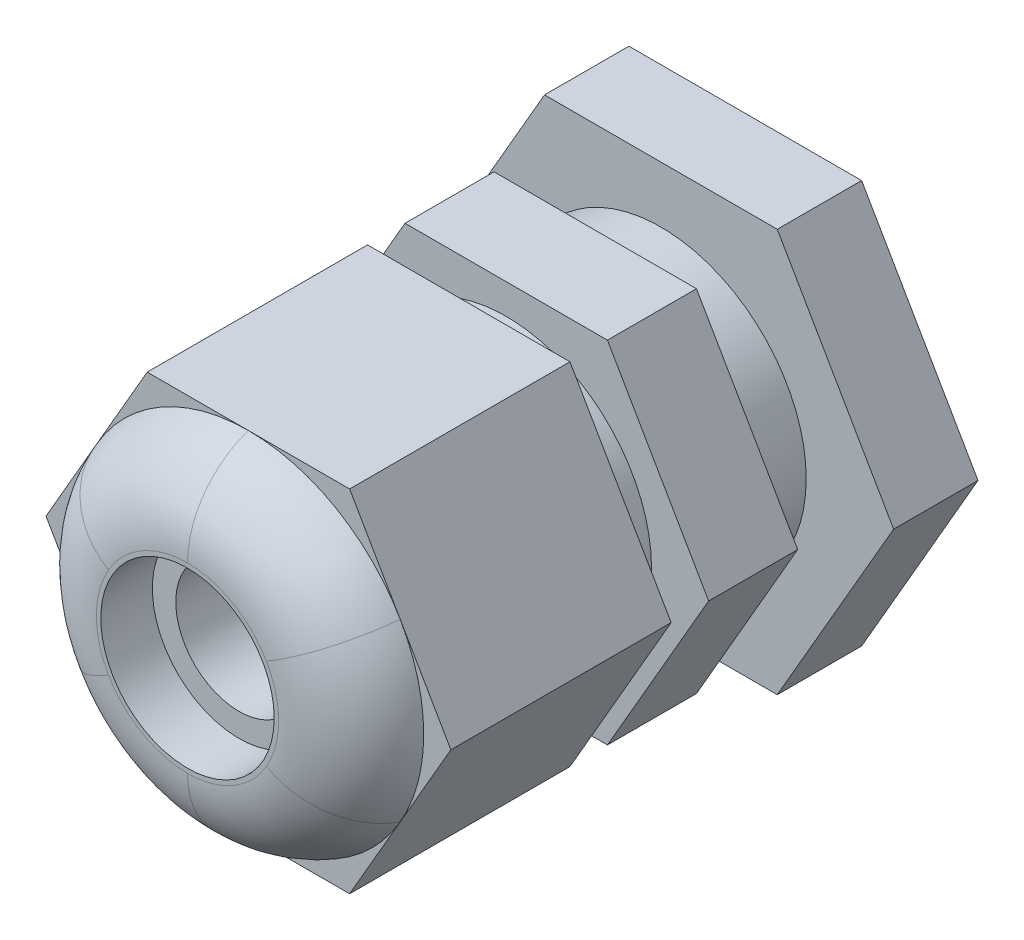
ISO-10303-21;
HEADER;
FILE_DESCRIPTION(('STEP AP214'),'2;1');
FILE_NAME('part.step','',(''),(''),'','','');
FILE_SCHEMA(('AUTOMOTIVE_DESIGN { 1 0 10303 214 1 1 1 1 }'));
ENDSEC;
DATA;
#1=APPLICATION_CONTEXT('core data for automotive mechanical design processes');
#2=APPLICATION_PROTOCOL_DEFINITION('international standard','automotive_design',2000,#1);
#3=PRODUCT_CONTEXT('',#1,'mechanical');
#4=PRODUCT('Part','Part','',(#3));
#5=PRODUCT_RELATED_PRODUCT_CATEGORY('part','',(#4));
#6=PRODUCT_DEFINITION_FORMATION('','',#4);
#7=PRODUCT_DEFINITION_CONTEXT('part definition',#1,'design');
#8=PRODUCT_DEFINITION('design','',#6,#7);
#9=PRODUCT_DEFINITION_SHAPE('','',#8);
#10=(LENGTH_UNIT() NAMED_UNIT(*) SI_UNIT(.MILLI.,.METRE.));
#11=(NAMED_UNIT(*) PLANE_ANGLE_UNIT() SI_UNIT($,.RADIAN.));
#12=(NAMED_UNIT(*) SI_UNIT($,.STERADIAN.) SOLID_ANGLE_UNIT());
#13=UNCERTAINTY_MEASURE_WITH_UNIT(LENGTH_MEASURE(1.E-05),#10,'distance_accuracy_value','');
#14=(GEOMETRIC_REPRESENTATION_CONTEXT(3) GLOBAL_UNCERTAINTY_ASSIGNED_CONTEXT((#13)) GLOBAL_UNIT_ASSIGNED_CONTEXT((#10,
#11,#12)) REPRESENTATION_CONTEXT('',''));
#15=CARTESIAN_POINT('',(0.,0.,0.));
#16=DIRECTION('',(0.,0.,1.));
#17=DIRECTION('',(1.,0.,0.));
#18=AXIS2_PLACEMENT_3D('',#15,#16,#17);
#19=CARTESIAN_POINT('',(0.,0.,11.75));
#20=DIRECTION('',(0.,0.,1.));
#21=DIRECTION('',(1.,0.,0.));
#22=AXIS2_PLACEMENT_3D('',#19,#20,#21);
#23=PLANE('',#22);
#24=CARTESIAN_POINT('',(0.,0.,11.75));
#25=DIRECTION('',(0.,0.,1.));
#26=DIRECTION('',(1.,0.,0.));
#27=AXIS2_PLACEMENT_3D('',#24,#25,#26);
#28=CIRCLE('',#27,9.35);
#29=CARTESIAN_POINT('',(8.0973375253845,4.675,11.75));
#30=VERTEX_POINT('',#29);
#31=CARTESIAN_POINT('',(0.,9.35,11.75));
#32=VERTEX_POINT('',#31);
#33=EDGE_CURVE('E222',#30,#32,#28,.T.);
#34=ORIENTED_EDGE('',*,*,#33,.F.);
#35=DIRECTION('',(-0.5,0.866025403784439,0.));
#36=VECTOR('',#35,1.);
#37=CARTESIAN_POINT('',(10.796450033846,0.,11.75));
#38=LINE('',#37,#36);
#39=CARTESIAN_POINT('',(5.39822501692301,9.35,11.75));
#40=VERTEX_POINT('',#39);
#41=EDGE_CURVE('E210',#30,#40,#38,.T.);
#42=ORIENTED_EDGE('',*,*,#41,.T.);
#43=DIRECTION('',(-1.,0.,0.));
#44=VECTOR('',#43,1.);
#45=CARTESIAN_POINT('',(5.39822501692301,9.35,11.75));
#46=LINE('',#45,#44);
#47=EDGE_CURVE('E223',#40,#32,#46,.T.);
#48=ORIENTED_EDGE('',*,*,#47,.T.);
#49=EDGE_LOOP('',(#34,#42,#48));
#50=FACE_BOUND('',#49,.T.);
#51=ADVANCED_FACE('F37',(#50),#23,.T.);
#52=CARTESIAN_POINT('',(-8.0973375253845,4.675,11.75));
#53=VERTEX_POINT('',#52);
#54=EDGE_CURVE('E231',#32,#53,#28,.T.);
#55=ORIENTED_EDGE('',*,*,#54,.F.);
#56=CARTESIAN_POINT('',(-5.398225016923,9.35,11.75));
#57=VERTEX_POINT('',#56);
#58=EDGE_CURVE('E209',#32,#57,#46,.T.);
#59=ORIENTED_EDGE('',*,*,#58,.T.);
#60=DIRECTION('',(-0.5,-0.866025403784439,0.));
#61=VECTOR('',#60,1.);
#62=CARTESIAN_POINT('',(-5.398225016923,9.35,11.75));
#63=LINE('',#62,#61);
#64=EDGE_CURVE('E304',#57,#53,#63,.T.);
#65=ORIENTED_EDGE('',*,*,#64,.T.);
#66=EDGE_LOOP('',(#55,#59,#65));
#67=FACE_BOUND('',#66,.T.);
#68=ADVANCED_FACE('F496',(#67),#23,.T.);
#69=CARTESIAN_POINT('',(-8.09733752538451,-4.675,11.75));
#70=VERTEX_POINT('',#69);
#71=EDGE_CURVE('E542',#53,#70,#28,.T.);
#72=ORIENTED_EDGE('',*,*,#71,.F.);
#73=CARTESIAN_POINT('',(-10.796450033846,0.,11.75));
#74=VERTEX_POINT('',#73);
#75=EDGE_CURVE('E307',#53,#74,#63,.T.);
#76=ORIENTED_EDGE('',*,*,#75,.T.);
#77=DIRECTION('',(0.5,-0.866025403784439,0.));
#78=VECTOR('',#77,1.);
#79=CARTESIAN_POINT('',(-10.796450033846,0.,11.75));
#80=LINE('',#79,#78);
#81=EDGE_CURVE('E300',#74,#70,#80,.T.);
#82=ORIENTED_EDGE('',*,*,#81,.T.);
#83=EDGE_LOOP('',(#72,#76,#82));
#84=FACE_BOUND('',#83,.T.);
#85=ADVANCED_FACE('F501',(#84),#23,.T.);
#86=CARTESIAN_POINT('',(0.,-9.35,11.75));
#87=VERTEX_POINT('',#86);
#88=EDGE_CURVE('E534',#70,#87,#28,.T.);
#89=ORIENTED_EDGE('',*,*,#88,.F.);
#90=CARTESIAN_POINT('',(-5.39822501692301,-9.35,11.75));
#91=VERTEX_POINT('',#90);
#92=EDGE_CURVE('E303',#70,#91,#80,.T.);
#93=ORIENTED_EDGE('',*,*,#92,.T.);
#94=DIRECTION('',(1.,0.,0.));
#95=VECTOR('',#94,1.);
#96=CARTESIAN_POINT('',(-5.39822501692301,-9.35,11.75));
#97=LINE('',#96,#95);
#98=EDGE_CURVE('E282',#91,#87,#97,.T.);
#99=ORIENTED_EDGE('',*,*,#98,.T.);
#100=EDGE_LOOP('',(#89,#93,#99));
#101=FACE_BOUND('',#100,.T.);
#102=ADVANCED_FACE('F520',(#101),#23,.T.);
#103=CARTESIAN_POINT('',(8.09733752538451,-4.675,11.75));
#104=VERTEX_POINT('',#103);
#105=EDGE_CURVE('E241',#87,#104,#28,.T.);
#106=ORIENTED_EDGE('',*,*,#105,.F.);
#107=CARTESIAN_POINT('',(5.398225016923,-9.35,11.75));
#108=VERTEX_POINT('',#107);
#109=EDGE_CURVE('E299',#87,#108,#97,.T.);
#110=ORIENTED_EDGE('',*,*,#109,.T.);
#111=DIRECTION('',(0.5,0.866025403784439,0.));
#112=VECTOR('',#111,1.);
#113=CARTESIAN_POINT('',(5.398225016923,-9.35,11.75));
#114=LINE('',#113,#112);
#115=EDGE_CURVE('E220',#108,#104,#114,.T.);
#116=ORIENTED_EDGE('',*,*,#115,.T.);
#117=EDGE_LOOP('',(#106,#110,#116));
#118=FACE_BOUND('',#117,.T.);
#119=ADVANCED_FACE('F508',(#118),#23,.T.);
#120=CARTESIAN_POINT('',(5.398225016923,-9.35,11.75));
#121=DIRECTION('',(-0.866025403784438,0.5,0.));
#122=DIRECTION('',(-0.5,-0.866025403784439,0.));
#123=AXIS2_PLACEMENT_3D('',#120,#121,#122);
#124=PLANE('',#123);
#125=DIRECTION('',(0.5,0.866025403784439,0.));
#126=VECTOR('',#125,1.);
#127=CARTESIAN_POINT('',(5.398225016923,-9.35,0.));
#128=LINE('',#127,#126);
#129=CARTESIAN_POINT('',(5.398225016923,-9.35,0.));
#130=VERTEX_POINT('',#129);
#131=CARTESIAN_POINT('',(10.796450033846,0.,0.));
#132=VERTEX_POINT('',#131);
#133=EDGE_CURVE('E293',#130,#132,#128,.T.);
#134=ORIENTED_EDGE('',*,*,#133,.T.);
#135=DIRECTION('',(0.,0.,-1.));
#136=VECTOR('',#135,1.);
#137=CARTESIAN_POINT('',(10.796450033846,0.,11.75));
#138=LINE('',#137,#136);
#139=CARTESIAN_POINT('',(10.796450033846,0.,11.75));
#140=VERTEX_POINT('',#139);
#141=EDGE_CURVE('E266',#140,#132,#138,.T.);
#142=ORIENTED_EDGE('',*,*,#141,.F.);
#143=EDGE_CURVE('E205',#104,#140,#114,.T.);
#144=ORIENTED_EDGE('',*,*,#143,.F.);
#145=ORIENTED_EDGE('',*,*,#115,.F.);
#146=DIRECTION('',(0.,0.,-1.));
#147=VECTOR('',#146,1.);
#148=CARTESIAN_POINT('',(5.398225016923,-9.35,11.75));
#149=LINE('',#148,#147);
#150=EDGE_CURVE('E279',#108,#130,#149,.T.);
#151=ORIENTED_EDGE('',*,*,#150,.T.);
#152=EDGE_LOOP('',(#134,#142,#144,#145,#151));
#153=FACE_BOUND('',#152,.T.);
#154=ADVANCED_FACE('F519',(#153),#124,.F.);
#155=CARTESIAN_POINT('',(10.796450033846,0.,11.75));
#156=DIRECTION('',(-0.866025403784439,-0.5,0.));
#157=DIRECTION('',(0.5,-0.866025403784439,0.));
#158=AXIS2_PLACEMENT_3D('',#155,#156,#157);
#159=PLANE('',#158);
#160=DIRECTION('',(-0.5,0.866025403784439,0.));
#161=VECTOR('',#160,1.);
#162=CARTESIAN_POINT('',(10.796450033846,0.,0.));
#163=LINE('',#162,#161);
#164=CARTESIAN_POINT('',(5.39822501692301,9.35,0.));
#165=VERTEX_POINT('',#164);
#166=EDGE_CURVE('E291',#132,#165,#163,.T.);
#167=ORIENTED_EDGE('',*,*,#166,.T.);
#168=DIRECTION('',(0.,0.,-1.));
#169=VECTOR('',#168,1.);
#170=CARTESIAN_POINT('',(5.39822501692301,9.35,11.75));
#171=LINE('',#170,#169);
#172=EDGE_CURVE('E216',#40,#165,#171,.T.);
#173=ORIENTED_EDGE('',*,*,#172,.F.);
#174=ORIENTED_EDGE('',*,*,#41,.F.);
#175=EDGE_CURVE('E199',#140,#30,#38,.T.);
#176=ORIENTED_EDGE('',*,*,#175,.F.);
#177=ORIENTED_EDGE('',*,*,#141,.T.);
#178=EDGE_LOOP('',(#167,#173,#174,#176,#177));
#179=FACE_BOUND('',#178,.T.);
#180=ADVANCED_FACE('F214',(#179),#159,.F.);
#181=CARTESIAN_POINT('',(5.39822501692301,9.35,11.75));
#182=DIRECTION('',(0.,-1.,0.));
#183=DIRECTION('',(1.,0.,0.));
#184=AXIS2_PLACEMENT_3D('',#181,#182,#183);
#185=PLANE('',#184);
#186=DIRECTION('',(-1.,0.,0.));
#187=VECTOR('',#186,1.);
#188=CARTESIAN_POINT('',(5.39822501692301,9.35,0.));
#189=LINE('',#188,#187);
#190=CARTESIAN_POINT('',(-5.398225016923,9.35,0.));
#191=VERTEX_POINT('',#190);
#192=EDGE_CURVE('E289',#165,#191,#189,.T.);
#193=ORIENTED_EDGE('',*,*,#192,.T.);
#194=DIRECTION('',(0.,0.,-1.));
#195=VECTOR('',#194,1.);
#196=CARTESIAN_POINT('',(-5.398225016923,9.35,11.75));
#197=LINE('',#196,#195);
#198=EDGE_CURVE('E270',#57,#191,#197,.T.);
#199=ORIENTED_EDGE('',*,*,#198,.F.);
#200=ORIENTED_EDGE('',*,*,#58,.F.);
#201=ORIENTED_EDGE('',*,*,#47,.F.);
#202=ORIENTED_EDGE('',*,*,#172,.T.);
#203=EDGE_LOOP('',(#193,#199,#200,#201,#202));
#204=FACE_BOUND('',#203,.T.);
#205=ADVANCED_FACE('F559',(#204),#185,.F.);
#206=CARTESIAN_POINT('',(-5.398225016923,9.35,11.75));
#207=DIRECTION('',(0.866025403784439,-0.5,0.));
#208=DIRECTION('',(0.5,0.866025403784439,0.));
#209=AXIS2_PLACEMENT_3D('',#206,#207,#208);
#210=PLANE('',#209);
#211=DIRECTION('',(-0.5,-0.866025403784439,0.));
#212=VECTOR('',#211,1.);
#213=CARTESIAN_POINT('',(-5.398225016923,9.35,0.));
#214=LINE('',#213,#212);
#215=CARTESIAN_POINT('',(-10.796450033846,0.,0.));
#216=VERTEX_POINT('',#215);
#217=EDGE_CURVE('E287',#191,#216,#214,.T.);
#218=ORIENTED_EDGE('',*,*,#217,.T.);
#219=DIRECTION('',(0.,0.,-1.));
#220=VECTOR('',#219,1.);
#221=CARTESIAN_POINT('',(-10.796450033846,0.,11.75));
#222=LINE('',#221,#220);
#223=EDGE_CURVE('E273',#74,#216,#222,.T.);
#224=ORIENTED_EDGE('',*,*,#223,.F.);
#225=ORIENTED_EDGE('',*,*,#75,.F.);
#226=ORIENTED_EDGE('',*,*,#64,.F.);
#227=ORIENTED_EDGE('',*,*,#198,.T.);
#228=EDGE_LOOP('',(#218,#224,#225,#226,#227));
#229=FACE_BOUND('',#228,.T.);
#230=ADVANCED_FACE('F556',(#229),#210,.F.);
#231=CARTESIAN_POINT('',(-10.796450033846,0.,11.75));
#232=DIRECTION('',(0.866025403784439,0.5,0.));
#233=DIRECTION('',(-0.5,0.866025403784439,0.));
#234=AXIS2_PLACEMENT_3D('',#231,#232,#233);
#235=PLANE('',#234);
#236=DIRECTION('',(0.5,-0.866025403784439,0.));
#237=VECTOR('',#236,1.);
#238=CARTESIAN_POINT('',(-10.796450033846,0.,0.));
#239=LINE('',#238,#237);
#240=CARTESIAN_POINT('',(-5.39822501692301,-9.35,0.));
#241=VERTEX_POINT('',#240);
#242=EDGE_CURVE('E285',#216,#241,#239,.T.);
#243=ORIENTED_EDGE('',*,*,#242,.T.);
#244=DIRECTION('',(0.,0.,-1.));
#245=VECTOR('',#244,1.);
#246=CARTESIAN_POINT('',(-5.39822501692301,-9.35,11.75));
#247=LINE('',#246,#245);
#248=EDGE_CURVE('E276',#91,#241,#247,.T.);
#249=ORIENTED_EDGE('',*,*,#248,.F.);
#250=ORIENTED_EDGE('',*,*,#92,.F.);
#251=ORIENTED_EDGE('',*,*,#81,.F.);
#252=ORIENTED_EDGE('',*,*,#223,.T.);
#253=EDGE_LOOP('',(#243,#249,#250,#251,#252));
#254=FACE_BOUND('',#253,.T.);
#255=ADVANCED_FACE('F515',(#254),#235,.F.);
#256=CARTESIAN_POINT('',(-5.39822501692301,-9.35,11.75));
#257=DIRECTION('',(0.,1.,0.));
#258=DIRECTION('',(0.,0.,1.));
#259=AXIS2_PLACEMENT_3D('',#256,#257,#258);
#260=PLANE('',#259);
#261=DIRECTION('',(1.,0.,0.));
#262=VECTOR('',#261,1.);
#263=CARTESIAN_POINT('',(-5.39822501692301,-9.35,0.));
#264=LINE('',#263,#262);
#265=EDGE_CURVE('E283',#241,#130,#264,.T.);
#266=ORIENTED_EDGE('',*,*,#265,.T.);
#267=ORIENTED_EDGE('',*,*,#150,.F.);
#268=ORIENTED_EDGE('',*,*,#109,.F.);
#269=ORIENTED_EDGE('',*,*,#98,.F.);
#270=ORIENTED_EDGE('',*,*,#248,.T.);
#271=EDGE_LOOP('',(#266,#267,#268,#269,#270));
#272=FACE_BOUND('',#271,.T.);
#273=ADVANCED_FACE('F507',(#272),#260,.F.);
#274=EDGE_CURVE('E203',#104,#30,#28,.T.);
#275=ORIENTED_EDGE('',*,*,#274,.F.);
#276=ORIENTED_EDGE('',*,*,#143,.T.);
#277=ORIENTED_EDGE('',*,*,#175,.T.);
#278=EDGE_LOOP('',(#275,#276,#277));
#279=FACE_BOUND('',#278,.T.);
#280=ADVANCED_FACE('F201',(#279),#23,.T.);
#281=CARTESIAN_POINT('',(0.,0.,0.));
#282=DIRECTION('',(0.,0.,1.));
#283=DIRECTION('',(1.,0.,0.));
#284=AXIS2_PLACEMENT_3D('',#281,#282,#283);
#285=PLANE('',#284);
#286=CARTESIAN_POINT('',(0.,0.,0.));
#287=DIRECTION('',(0.,0.,-1.));
#288=DIRECTION('',(-1.,0.,0.));
#289=AXIS2_PLACEMENT_3D('',#286,#287,#288);
#290=CIRCLE('',#289,7.75);
#291=CARTESIAN_POINT('',(-7.75,0.,0.));
#292=VERTEX_POINT('',#291);
#293=EDGE_CURVE('E268',#292,#292,#290,.T.);
#294=ORIENTED_EDGE('',*,*,#293,.F.);
#295=EDGE_LOOP('',(#294));
#296=FACE_BOUND('',#295,.T.);
#297=ORIENTED_EDGE('',*,*,#133,.F.);
#298=ORIENTED_EDGE('',*,*,#265,.F.);
#299=ORIENTED_EDGE('',*,*,#242,.F.);
#300=ORIENTED_EDGE('',*,*,#217,.F.);
#301=ORIENTED_EDGE('',*,*,#192,.F.);
#302=ORIENTED_EDGE('',*,*,#166,.F.);
#303=EDGE_LOOP('',(#297,#298,#299,#300,#301,#302));
#304=FACE_BOUND('',#303,.T.);
#305=ADVANCED_FACE('F506',(#296,#304),#285,.F.);
#306=CARTESIAN_POINT('',(0.,0.,-2.));
#307=DIRECTION('',(0.,0.,1.));
#308=DIRECTION('',(1.,0.,0.));
#309=AXIS2_PLACEMENT_3D('',#306,#307,#308);
#310=CYLINDRICAL_SURFACE('',#309,7.75);
#311=CARTESIAN_POINT('',(0.,0.,-2.));
#312=DIRECTION('',(0.,0.,-1.));
#313=DIRECTION('',(-1.,0.,0.));
#314=AXIS2_PLACEMENT_3D('',#311,#312,#313);
#315=CIRCLE('',#314,7.75);
#316=CARTESIAN_POINT('',(-7.75,0.,-2.));
#317=VERTEX_POINT('',#316);
#318=EDGE_CURVE('E296',#317,#317,#315,.T.);
#319=ORIENTED_EDGE('',*,*,#318,.F.);
#320=EDGE_LOOP('',(#319));
#321=FACE_BOUND('',#320,.T.);
#322=ORIENTED_EDGE('',*,*,#293,.T.);
#323=EDGE_LOOP('',(#322));
#324=FACE_BOUND('',#323,.T.);
#325=ADVANCED_FACE('F513',(#321,#324),#310,.T.);
#326=CARTESIAN_POINT('',(-5.39822501692299,-9.35000000000001,-6.75));
#327=DIRECTION('',(0.866025403784438,0.5,0.));
#328=DIRECTION('',(-0.5,0.866025403784438,0.));
#329=AXIS2_PLACEMENT_3D('',#326,#327,#328);
#330=PLANE('',#329);
#331=DIRECTION('',(-0.5,0.866025403784438,0.));
#332=VECTOR('',#331,1.);
#333=CARTESIAN_POINT('',(-5.39822501692299,-9.35000000000001,-2.));
#334=LINE('',#333,#332);
#335=CARTESIAN_POINT('',(-5.39822501692299,-9.35000000000001,-2.));
#336=VERTEX_POINT('',#335);
#337=CARTESIAN_POINT('',(-10.796450033846,0.,-2.));
#338=VERTEX_POINT('',#337);
#339=EDGE_CURVE('E346',#336,#338,#334,.T.);
#340=ORIENTED_EDGE('',*,*,#339,.T.);
#341=DIRECTION('',(0.,0.,1.));
#342=VECTOR('',#341,1.);
#343=CARTESIAN_POINT('',(-10.796450033846,0.,-6.75));
#344=LINE('',#343,#342);
#345=CARTESIAN_POINT('',(-10.796450033846,0.,-6.75));
#346=VERTEX_POINT('',#345);
#347=EDGE_CURVE('E316',#346,#338,#344,.T.);
#348=ORIENTED_EDGE('',*,*,#347,.F.);
#349=DIRECTION('',(-0.5,0.866025403784438,0.));
#350=VECTOR('',#349,1.);
#351=CARTESIAN_POINT('',(-5.39822501692299,-9.35000000000001,-6.75));
#352=LINE('',#351,#350);
#353=CARTESIAN_POINT('',(-5.39822501692299,-9.35000000000001,-6.75));
#354=VERTEX_POINT('',#353);
#355=EDGE_CURVE('E337',#354,#346,#352,.T.);
#356=ORIENTED_EDGE('',*,*,#355,.F.);
#357=DIRECTION('',(0.,0.,1.));
#358=VECTOR('',#357,1.);
#359=CARTESIAN_POINT('',(-5.39822501692299,-9.35000000000001,-6.75));
#360=LINE('',#359,#358);
#361=EDGE_CURVE('E331',#354,#336,#360,.T.);
#362=ORIENTED_EDGE('',*,*,#361,.T.);
#363=EDGE_LOOP('',(#340,#348,#356,#362));
#364=FACE_BOUND('',#363,.T.);
#365=ADVANCED_FACE('F703',(#364),#330,.F.);
#366=CARTESIAN_POINT('',(-10.796450033846,0.,-6.75));
#367=DIRECTION('',(0.866025403784439,-0.499999999999999,0.));
#368=DIRECTION('',(0.499999999999999,0.866025403784439,0.));
#369=AXIS2_PLACEMENT_3D('',#366,#367,#368);
#370=PLANE('',#369);
#371=DIRECTION('',(0.499999999999999,0.866025403784439,0.));
#372=VECTOR('',#371,1.);
#373=CARTESIAN_POINT('',(-10.796450033846,0.,-2.));
#374=LINE('',#373,#372);
#375=CARTESIAN_POINT('',(-5.39822501692301,9.35000000000001,-2.));
#376=VERTEX_POINT('',#375);
#377=EDGE_CURVE('E344',#338,#376,#374,.T.);
#378=ORIENTED_EDGE('',*,*,#377,.T.);
#379=DIRECTION('',(0.,0.,1.));
#380=VECTOR('',#379,1.);
#381=CARTESIAN_POINT('',(-5.39822501692301,9.35000000000001,-6.75));
#382=LINE('',#381,#380);
#383=CARTESIAN_POINT('',(-5.39822501692301,9.35000000000001,-6.75));
#384=VERTEX_POINT('',#383);
#385=EDGE_CURVE('E319',#384,#376,#382,.T.);
#386=ORIENTED_EDGE('',*,*,#385,.F.);
#387=DIRECTION('',(0.499999999999999,0.866025403784439,0.));
#388=VECTOR('',#387,1.);
#389=CARTESIAN_POINT('',(-10.796450033846,0.,-6.75));
#390=LINE('',#389,#388);
#391=EDGE_CURVE('E357',#346,#384,#390,.T.);
#392=ORIENTED_EDGE('',*,*,#391,.F.);
#393=ORIENTED_EDGE('',*,*,#347,.T.);
#394=EDGE_LOOP('',(#378,#386,#392,#393));
#395=FACE_BOUND('',#394,.T.);
#396=ADVANCED_FACE('F711',(#395),#370,.F.);
#397=CARTESIAN_POINT('',(-5.39822501692301,9.35000000000001,-6.75));
#398=DIRECTION('',(0.,-1.,0.));
#399=DIRECTION('',(1.,0.,0.));
#400=AXIS2_PLACEMENT_3D('',#397,#398,#399);
#401=PLANE('',#400);
#402=DIRECTION('',(1.,0.,0.));
#403=VECTOR('',#402,1.);
#404=CARTESIAN_POINT('',(-5.39822501692301,9.35000000000001,-2.));
#405=LINE('',#404,#403);
#406=CARTESIAN_POINT('',(5.398225016923,9.35000000000002,-2.));
#407=VERTEX_POINT('',#406);
#408=EDGE_CURVE('E342',#376,#407,#405,.T.);
#409=ORIENTED_EDGE('',*,*,#408,.T.);
#410=DIRECTION('',(0.,0.,1.));
#411=VECTOR('',#410,1.);
#412=CARTESIAN_POINT('',(5.398225016923,9.35000000000002,-6.75));
#413=LINE('',#412,#411);
#414=CARTESIAN_POINT('',(5.398225016923,9.35000000000002,-6.75));
#415=VERTEX_POINT('',#414);
#416=EDGE_CURVE('E322',#415,#407,#413,.T.);
#417=ORIENTED_EDGE('',*,*,#416,.F.);
#418=DIRECTION('',(1.,0.,0.));
#419=VECTOR('',#418,1.);
#420=CARTESIAN_POINT('',(-5.39822501692301,9.35000000000001,-6.75));
#421=LINE('',#420,#419);
#422=EDGE_CURVE('E355',#384,#415,#421,.T.);
#423=ORIENTED_EDGE('',*,*,#422,.F.);
#424=ORIENTED_EDGE('',*,*,#385,.T.);
#425=EDGE_LOOP('',(#409,#417,#423,#424));
#426=FACE_BOUND('',#425,.T.);
#427=ADVANCED_FACE('F720',(#426),#401,.F.);
#428=CARTESIAN_POINT('',(5.398225016923,9.35000000000002,-6.75));
#429=DIRECTION('',(-0.866025403784438,-0.500000000000001,0.));
#430=DIRECTION('',(0.500000000000001,-0.866025403784438,0.));
#431=AXIS2_PLACEMENT_3D('',#428,#429,#430);
#432=PLANE('',#431);
#433=DIRECTION('',(0.500000000000001,-0.866025403784438,0.));
#434=VECTOR('',#433,1.);
#435=CARTESIAN_POINT('',(5.398225016923,9.35000000000002,-2.));
#436=LINE('',#435,#434);
#437=CARTESIAN_POINT('',(10.796450033846,0.,-2.));
#438=VERTEX_POINT('',#437);
#439=EDGE_CURVE('E340',#407,#438,#436,.T.);
#440=ORIENTED_EDGE('',*,*,#439,.T.);
#441=DIRECTION('',(0.,0.,1.));
#442=VECTOR('',#441,1.);
#443=CARTESIAN_POINT('',(10.796450033846,0.,-6.75));
#444=LINE('',#443,#442);
#445=CARTESIAN_POINT('',(10.796450033846,0.,-6.75));
#446=VERTEX_POINT('',#445);
#447=EDGE_CURVE('E325',#446,#438,#444,.T.);
#448=ORIENTED_EDGE('',*,*,#447,.F.);
#449=DIRECTION('',(0.500000000000001,-0.866025403784438,0.));
#450=VECTOR('',#449,1.);
#451=CARTESIAN_POINT('',(5.398225016923,9.35000000000002,-6.75));
#452=LINE('',#451,#450);
#453=EDGE_CURVE('E353',#415,#446,#452,.T.);
#454=ORIENTED_EDGE('',*,*,#453,.F.);
#455=ORIENTED_EDGE('',*,*,#416,.T.);
#456=EDGE_LOOP('',(#440,#448,#454,#455));
#457=FACE_BOUND('',#456,.T.);
#458=ADVANCED_FACE('F729',(#457),#432,.F.);
#459=CARTESIAN_POINT('',(10.796450033846,0.,-6.75));
#460=DIRECTION('',(-0.866025403784439,0.499999999999999,0.));
#461=DIRECTION('',(-0.499999999999999,-0.866025403784439,0.));
#462=AXIS2_PLACEMENT_3D('',#459,#460,#461);
#463=PLANE('',#462);
#464=DIRECTION('',(-0.499999999999999,-0.866025403784439,0.));
#465=VECTOR('',#464,1.);
#466=CARTESIAN_POINT('',(10.796450033846,0.,-2.));
#467=LINE('',#466,#465);
#468=CARTESIAN_POINT('',(5.39822501692302,-9.35,-2.));
#469=VERTEX_POINT('',#468);
#470=EDGE_CURVE('E338',#438,#469,#467,.T.);
#471=ORIENTED_EDGE('',*,*,#470,.T.);
#472=DIRECTION('',(0.,0.,1.));
#473=VECTOR('',#472,1.);
#474=CARTESIAN_POINT('',(5.39822501692302,-9.35,-6.75));
#475=LINE('',#474,#473);
#476=CARTESIAN_POINT('',(5.39822501692302,-9.35,-6.75));
#477=VERTEX_POINT('',#476);
#478=EDGE_CURVE('E328',#477,#469,#475,.T.);
#479=ORIENTED_EDGE('',*,*,#478,.F.);
#480=DIRECTION('',(-0.499999999999999,-0.866025403784439,0.));
#481=VECTOR('',#480,1.);
#482=CARTESIAN_POINT('',(10.796450033846,0.,-6.75));
#483=LINE('',#482,#481);
#484=EDGE_CURVE('E351',#446,#477,#483,.T.);
#485=ORIENTED_EDGE('',*,*,#484,.F.);
#486=ORIENTED_EDGE('',*,*,#447,.T.);
#487=EDGE_LOOP('',(#471,#479,#485,#486));
#488=FACE_BOUND('',#487,.T.);
#489=ADVANCED_FACE('F738',(#488),#463,.F.);
#490=CARTESIAN_POINT('',(5.39822501692302,-9.35,-6.75));
#491=DIRECTION('',(0.,1.,0.));
#492=DIRECTION('',(-1.,0.,0.));
#493=AXIS2_PLACEMENT_3D('',#490,#491,#492);
#494=PLANE('',#493);
#495=DIRECTION('',(-1.,0.,0.));
#496=VECTOR('',#495,1.);
#497=CARTESIAN_POINT('',(5.39822501692302,-9.35,-2.));
#498=LINE('',#497,#496);
#499=EDGE_CURVE('E335',#469,#336,#498,.T.);
#500=ORIENTED_EDGE('',*,*,#499,.T.);
#501=ORIENTED_EDGE('',*,*,#361,.F.);
#502=DIRECTION('',(-1.,0.,0.));
#503=VECTOR('',#502,1.);
#504=CARTESIAN_POINT('',(5.39822501692302,-9.35,-6.75));
#505=LINE('',#504,#503);
#506=EDGE_CURVE('E334',#477,#354,#505,.T.);
#507=ORIENTED_EDGE('',*,*,#506,.F.);
#508=ORIENTED_EDGE('',*,*,#478,.T.);
#509=EDGE_LOOP('',(#500,#501,#507,#508));
#510=FACE_BOUND('',#509,.T.);
#511=ADVANCED_FACE('F747',(#510),#494,.F.);
#512=CARTESIAN_POINT('',(0.,0.,-6.75));
#513=DIRECTION('',(0.,0.,-1.));
#514=DIRECTION('',(-1.,0.,0.));
#515=AXIS2_PLACEMENT_3D('',#512,#513,#514);
#516=PLANE('',#515);
#517=CARTESIAN_POINT('',(0.,0.,-6.75));
#518=DIRECTION('',(0.,0.,-1.));
#519=DIRECTION('',(-1.,0.,0.));
#520=AXIS2_PLACEMENT_3D('',#517,#518,#519);
#521=CIRCLE('',#520,7.75);
#522=CARTESIAN_POINT('',(-7.75,0.,-6.75));
#523=VERTEX_POINT('',#522);
#524=EDGE_CURVE('E313',#523,#523,#521,.T.);
#525=ORIENTED_EDGE('',*,*,#524,.F.);
#526=EDGE_LOOP('',(#525));
#527=FACE_BOUND('',#526,.T.);
#528=ORIENTED_EDGE('',*,*,#355,.T.);
#529=ORIENTED_EDGE('',*,*,#391,.T.);
#530=ORIENTED_EDGE('',*,*,#422,.T.);
#531=ORIENTED_EDGE('',*,*,#453,.T.);
#532=ORIENTED_EDGE('',*,*,#484,.T.);
#533=ORIENTED_EDGE('',*,*,#506,.T.);
#534=EDGE_LOOP('',(#528,#529,#530,#531,#532,#533));
#535=FACE_BOUND('',#534,.T.);
#536=ADVANCED_FACE('F756',(#527,#535),#516,.T.);
#537=CARTESIAN_POINT('',(0.,0.,-2.));
#538=DIRECTION('',(0.,0.,-1.));
#539=DIRECTION('',(-1.,0.,0.));
#540=AXIS2_PLACEMENT_3D('',#537,#538,#539);
#541=PLANE('',#540);
#542=ORIENTED_EDGE('',*,*,#318,.T.);
#543=EDGE_LOOP('',(#542));
#544=FACE_BOUND('',#543,.T.);
#545=ORIENTED_EDGE('',*,*,#339,.F.);
#546=ORIENTED_EDGE('',*,*,#499,.F.);
#547=ORIENTED_EDGE('',*,*,#470,.F.);
#548=ORIENTED_EDGE('',*,*,#439,.F.);
#549=ORIENTED_EDGE('',*,*,#408,.F.);
#550=ORIENTED_EDGE('',*,*,#377,.F.);
#551=EDGE_LOOP('',(#545,#546,#547,#548,#549,#550));
#552=FACE_BOUND('',#551,.T.);
#553=ADVANCED_FACE('F766',(#544,#552),#541,.F.);
#554=CARTESIAN_POINT('',(0.,0.,-10.25));
#555=DIRECTION('',(0.,0.,1.));
#556=DIRECTION('',(1.,0.,0.));
#557=AXIS2_PLACEMENT_3D('',#554,#555,#556);
#558=CYLINDRICAL_SURFACE('',#557,7.75);
#559=CARTESIAN_POINT('',(0.,0.,-10.25));
#560=DIRECTION('',(0.,0.,-1.));
#561=DIRECTION('',(-1.,0.,0.));
#562=AXIS2_PLACEMENT_3D('',#559,#560,#561);
#563=CIRCLE('',#562,7.75);
#564=CARTESIAN_POINT('',(-7.75,0.,-10.25));
#565=VERTEX_POINT('',#564);
#566=EDGE_CURVE('E349',#565,#565,#563,.T.);
#567=ORIENTED_EDGE('',*,*,#566,.F.);
#568=EDGE_LOOP('',(#567));
#569=FACE_BOUND('',#568,.T.);
#570=ORIENTED_EDGE('',*,*,#524,.T.);
#571=EDGE_LOOP('',(#570));
#572=FACE_BOUND('',#571,.T.);
#573=ADVANCED_FACE('F775',(#569,#572),#558,.T.);
#574=CARTESIAN_POINT('',(-6.20651539378848,-10.75,-14.75));
#575=DIRECTION('',(0.866025403784439,0.5,0.));
#576=DIRECTION('',(-0.5,0.866025403784439,0.));
#577=AXIS2_PLACEMENT_3D('',#574,#575,#576);
#578=PLANE('',#577);
#579=DIRECTION('',(-0.5,0.866025403784439,0.));
#580=VECTOR('',#579,1.);
#581=CARTESIAN_POINT('',(-6.20651539378848,-10.75,-10.25));
#582=LINE('',#581,#580);
#583=CARTESIAN_POINT('',(-6.20651539378848,-10.75,-10.25));
#584=VERTEX_POINT('',#583);
#585=CARTESIAN_POINT('',(-12.413030787577,0.,-10.25));
#586=VERTEX_POINT('',#585);
#587=EDGE_CURVE('E395',#584,#586,#582,.T.);
#588=ORIENTED_EDGE('',*,*,#587,.T.);
#589=DIRECTION('',(0.,0.,1.));
#590=VECTOR('',#589,1.);
#591=CARTESIAN_POINT('',(-12.413030787577,0.,-14.75));
#592=LINE('',#591,#590);
#593=CARTESIAN_POINT('',(-12.413030787577,0.,-14.75));
#594=VERTEX_POINT('',#593);
#595=EDGE_CURVE('E365',#594,#586,#592,.T.);
#596=ORIENTED_EDGE('',*,*,#595,.F.);
#597=DIRECTION('',(-0.5,0.866025403784439,0.));
#598=VECTOR('',#597,1.);
#599=CARTESIAN_POINT('',(-6.20651539378848,-10.75,-14.75));
#600=LINE('',#599,#598);
#601=CARTESIAN_POINT('',(-6.20651539378848,-10.75,-14.75));
#602=VERTEX_POINT('',#601);
#603=EDGE_CURVE('E386',#602,#594,#600,.T.);
#604=ORIENTED_EDGE('',*,*,#603,.F.);
#605=DIRECTION('',(0.,0.,1.));
#606=VECTOR('',#605,1.);
#607=CARTESIAN_POINT('',(-6.20651539378848,-10.75,-14.75));
#608=LINE('',#607,#606);
#609=EDGE_CURVE('E380',#602,#584,#608,.T.);
#610=ORIENTED_EDGE('',*,*,#609,.T.);
#611=EDGE_LOOP('',(#588,#596,#604,#610));
#612=FACE_BOUND('',#611,.T.);
#613=ADVANCED_FACE('F467',(#612),#578,.F.);
#614=CARTESIAN_POINT('',(-12.413030787577,0.,-14.75));
#615=DIRECTION('',(0.866025403784438,-0.5,0.));
#616=DIRECTION('',(0.500000000000001,0.866025403784438,0.));
#617=AXIS2_PLACEMENT_3D('',#614,#615,#616);
#618=PLANE('',#617);
#619=DIRECTION('',(0.5,0.866025403784438,0.));
#620=VECTOR('',#619,1.);
#621=CARTESIAN_POINT('',(-12.413030787577,0.,-10.25));
#622=LINE('',#621,#620);
#623=CARTESIAN_POINT('',(-6.20651539378847,10.75,-10.25));
#624=VERTEX_POINT('',#623);
#625=EDGE_CURVE('E393',#586,#624,#622,.T.);
#626=ORIENTED_EDGE('',*,*,#625,.T.);
#627=DIRECTION('',(0.,0.,1.));
#628=VECTOR('',#627,1.);
#629=CARTESIAN_POINT('',(-6.20651539378847,10.75,-14.75));
#630=LINE('',#629,#628);
#631=CARTESIAN_POINT('',(-6.20651539378847,10.75,-14.75));
#632=VERTEX_POINT('',#631);
#633=EDGE_CURVE('E368',#632,#624,#630,.T.);
#634=ORIENTED_EDGE('',*,*,#633,.F.);
#635=DIRECTION('',(0.5,0.866025403784438,0.));
#636=VECTOR('',#635,1.);
#637=CARTESIAN_POINT('',(-12.413030787577,0.,-14.75));
#638=LINE('',#637,#636);
#639=EDGE_CURVE('E406',#594,#632,#638,.T.);
#640=ORIENTED_EDGE('',*,*,#639,.F.);
#641=ORIENTED_EDGE('',*,*,#595,.T.);
#642=EDGE_LOOP('',(#626,#634,#640,#641));
#643=FACE_BOUND('',#642,.T.);
#644=ADVANCED_FACE('F470',(#643),#618,.F.);
#645=CARTESIAN_POINT('',(-6.20651539378847,10.75,-14.75));
#646=DIRECTION('',(0.,-1.,0.));
#647=DIRECTION('',(0.,0.,-1.));
#648=AXIS2_PLACEMENT_3D('',#645,#646,#647);
#649=PLANE('',#648);
#650=DIRECTION('',(1.,0.,0.));
#651=VECTOR('',#650,1.);
#652=CARTESIAN_POINT('',(-6.20651539378847,10.75,-10.25));
#653=LINE('',#652,#651);
#654=CARTESIAN_POINT('',(6.20651539378848,10.75,-10.25));
#655=VERTEX_POINT('',#654);
#656=EDGE_CURVE('E391',#624,#655,#653,.T.);
#657=ORIENTED_EDGE('',*,*,#656,.T.);
#658=DIRECTION('',(0.,0.,1.));
#659=VECTOR('',#658,1.);
#660=CARTESIAN_POINT('',(6.20651539378848,10.75,-14.75));
#661=LINE('',#660,#659);
#662=CARTESIAN_POINT('',(6.20651539378848,10.75,-14.75));
#663=VERTEX_POINT('',#662);
#664=EDGE_CURVE('E371',#663,#655,#661,.T.);
#665=ORIENTED_EDGE('',*,*,#664,.F.);
#666=DIRECTION('',(1.,0.,0.));
#667=VECTOR('',#666,1.);
#668=CARTESIAN_POINT('',(-6.20651539378847,10.75,-14.75));
#669=LINE('',#668,#667);
#670=EDGE_CURVE('E404',#632,#663,#669,.T.);
#671=ORIENTED_EDGE('',*,*,#670,.F.);
#672=ORIENTED_EDGE('',*,*,#633,.T.);
#673=EDGE_LOOP('',(#657,#665,#671,#672));
#674=FACE_BOUND('',#673,.T.);
#675=ADVANCED_FACE('F475',(#674),#649,.F.);
#676=CARTESIAN_POINT('',(6.20651539378848,10.75,-14.75));
#677=DIRECTION('',(-0.866025403784438,-0.5,0.));
#678=DIRECTION('',(0.5,-0.866025403784439,0.));
#679=AXIS2_PLACEMENT_3D('',#676,#677,#678);
#680=PLANE('',#679);
#681=DIRECTION('',(0.5,-0.866025403784439,0.));
#682=VECTOR('',#681,1.);
#683=CARTESIAN_POINT('',(6.20651539378848,10.75,-10.25));
#684=LINE('',#683,#682);
#685=CARTESIAN_POINT('',(12.413030787577,0.,-10.25));
#686=VERTEX_POINT('',#685);
#687=EDGE_CURVE('E389',#655,#686,#684,.T.);
#688=ORIENTED_EDGE('',*,*,#687,.T.);
#689=DIRECTION('',(0.,0.,1.));
#690=VECTOR('',#689,1.);
#691=CARTESIAN_POINT('',(12.413030787577,0.,-14.75));
#692=LINE('',#691,#690);
#693=CARTESIAN_POINT('',(12.413030787577,0.,-14.75));
#694=VERTEX_POINT('',#693);
#695=EDGE_CURVE('E374',#694,#686,#692,.T.);
#696=ORIENTED_EDGE('',*,*,#695,.F.);
#697=DIRECTION('',(0.5,-0.866025403784439,0.));
#698=VECTOR('',#697,1.);
#699=CARTESIAN_POINT('',(6.20651539378848,10.75,-14.75));
#700=LINE('',#699,#698);
#701=EDGE_CURVE('E402',#663,#694,#700,.T.);
#702=ORIENTED_EDGE('',*,*,#701,.F.);
#703=ORIENTED_EDGE('',*,*,#664,.T.);
#704=EDGE_LOOP('',(#688,#696,#702,#703));
#705=FACE_BOUND('',#704,.T.);
#706=ADVANCED_FACE('F481',(#705),#680,.F.);
#707=CARTESIAN_POINT('',(12.413030787577,0.,-14.75));
#708=DIRECTION('',(-0.866025403784438,0.5,0.));
#709=DIRECTION('',(-0.5,-0.866025403784439,0.));
#710=AXIS2_PLACEMENT_3D('',#707,#708,#709);
#711=PLANE('',#710);
#712=DIRECTION('',(-0.5,-0.866025403784438,0.));
#713=VECTOR('',#712,1.);
#714=CARTESIAN_POINT('',(12.413030787577,0.,-10.25));
#715=LINE('',#714,#713);
#716=CARTESIAN_POINT('',(6.20651539378847,-10.75,-10.25));
#717=VERTEX_POINT('',#716);
#718=EDGE_CURVE('E387',#686,#717,#715,.T.);
#719=ORIENTED_EDGE('',*,*,#718,.T.);
#720=DIRECTION('',(0.,0.,1.));
#721=VECTOR('',#720,1.);
#722=CARTESIAN_POINT('',(6.20651539378847,-10.75,-14.75));
#723=LINE('',#722,#721);
#724=CARTESIAN_POINT('',(6.20651539378847,-10.75,-14.75));
#725=VERTEX_POINT('',#724);
#726=EDGE_CURVE('E377',#725,#717,#723,.T.);
#727=ORIENTED_EDGE('',*,*,#726,.F.);
#728=DIRECTION('',(-0.5,-0.866025403784438,0.));
#729=VECTOR('',#728,1.);
#730=CARTESIAN_POINT('',(12.413030787577,0.,-14.75));
#731=LINE('',#730,#729);
#732=EDGE_CURVE('E400',#694,#725,#731,.T.);
#733=ORIENTED_EDGE('',*,*,#732,.F.);
#734=ORIENTED_EDGE('',*,*,#695,.T.);
#735=EDGE_LOOP('',(#719,#727,#733,#734));
#736=FACE_BOUND('',#735,.T.);
#737=ADVANCED_FACE('F485',(#736),#711,.F.);
#738=CARTESIAN_POINT('',(6.20651539378847,-10.75,-14.75));
#739=DIRECTION('',(0.,1.,0.));
#740=DIRECTION('',(0.,0.,1.));
#741=AXIS2_PLACEMENT_3D('',#738,#739,#740);
#742=PLANE('',#741);
#743=DIRECTION('',(-1.,0.,0.));
#744=VECTOR('',#743,1.);
#745=CARTESIAN_POINT('',(6.20651539378847,-10.75,-10.25));
#746=LINE('',#745,#744);
#747=EDGE_CURVE('E384',#717,#584,#746,.T.);
#748=ORIENTED_EDGE('',*,*,#747,.T.);
#749=ORIENTED_EDGE('',*,*,#609,.F.);
#750=DIRECTION('',(-1.,0.,0.));
#751=VECTOR('',#750,1.);
#752=CARTESIAN_POINT('',(6.20651539378847,-10.75,-14.75));
#753=LINE('',#752,#751);
#754=EDGE_CURVE('E383',#725,#602,#753,.T.);
#755=ORIENTED_EDGE('',*,*,#754,.F.);
#756=ORIENTED_EDGE('',*,*,#726,.T.);
#757=EDGE_LOOP('',(#748,#749,#755,#756));
#758=FACE_BOUND('',#757,.T.);
#759=ADVANCED_FACE('F459',(#758),#742,.F.);
#760=CARTESIAN_POINT('',(0.,0.,-14.75));
#761=DIRECTION('',(0.,0.,-1.));
#762=DIRECTION('',(-1.,0.,0.));
#763=AXIS2_PLACEMENT_3D('',#760,#761,#762);
#764=PLANE('',#763);
#765=CARTESIAN_POINT('',(0.,0.,-14.75));
#766=DIRECTION('',(0.,0.,-1.));
#767=DIRECTION('',(-1.,0.,0.));
#768=AXIS2_PLACEMENT_3D('',#765,#766,#767);
#769=CIRCLE('',#768,7.75);
#770=CARTESIAN_POINT('',(-7.75,0.,-14.75));
#771=VERTEX_POINT('',#770);
#772=EDGE_CURVE('E242',#771,#771,#769,.T.);
#773=ORIENTED_EDGE('',*,*,#772,.F.);
#774=EDGE_LOOP('',(#773));
#775=FACE_BOUND('',#774,.T.);
#776=ORIENTED_EDGE('',*,*,#603,.T.);
#777=ORIENTED_EDGE('',*,*,#639,.T.);
#778=ORIENTED_EDGE('',*,*,#670,.T.);
#779=ORIENTED_EDGE('',*,*,#701,.T.);
#780=ORIENTED_EDGE('',*,*,#732,.T.);
#781=ORIENTED_EDGE('',*,*,#754,.T.);
#782=EDGE_LOOP('',(#776,#777,#778,#779,#780,#781));
#783=FACE_BOUND('',#782,.T.);
#784=ADVANCED_FACE('F456',(#775,#783),#764,.T.);
#785=CARTESIAN_POINT('',(0.,0.,-10.25));
#786=DIRECTION('',(0.,0.,-1.));
#787=DIRECTION('',(-1.,0.,0.));
#788=AXIS2_PLACEMENT_3D('',#785,#786,#787);
#789=PLANE('',#788);
#790=ORIENTED_EDGE('',*,*,#566,.T.);
#791=EDGE_LOOP('',(#790));
#792=FACE_BOUND('',#791,.T.);
#793=ORIENTED_EDGE('',*,*,#587,.F.);
#794=ORIENTED_EDGE('',*,*,#747,.F.);
#795=ORIENTED_EDGE('',*,*,#718,.F.);
#796=ORIENTED_EDGE('',*,*,#687,.F.);
#797=ORIENTED_EDGE('',*,*,#656,.F.);
#798=ORIENTED_EDGE('',*,*,#625,.F.);
#799=EDGE_LOOP('',(#793,#794,#795,#796,#797,#798));
#800=FACE_BOUND('',#799,.T.);
#801=ADVANCED_FACE('F452',(#792,#800),#789,.F.);
#802=CARTESIAN_POINT('',(0.,0.,-16.));
#803=DIRECTION('',(0.,0.,1.));
#804=DIRECTION('',(1.,0.,0.));
#805=AXIS2_PLACEMENT_3D('',#802,#803,#804);
#806=CYLINDRICAL_SURFACE('',#805,7.75);
#807=CARTESIAN_POINT('',(0.,0.,-16.));
#808=DIRECTION('',(0.,0.,-1.));
#809=DIRECTION('',(-1.,0.,0.));
#810=AXIS2_PLACEMENT_3D('',#807,#808,#809);
#811=CIRCLE('',#810,7.75);
#812=CARTESIAN_POINT('',(-7.75,0.,-16.));
#813=VERTEX_POINT('',#812);
#814=EDGE_CURVE('E398',#813,#813,#811,.T.);
#815=ORIENTED_EDGE('',*,*,#814,.F.);
#816=EDGE_LOOP('',(#815));
#817=FACE_BOUND('',#816,.T.);
#818=ORIENTED_EDGE('',*,*,#772,.T.);
#819=EDGE_LOOP('',(#818));
#820=FACE_BOUND('',#819,.T.);
#821=ADVANCED_FACE('F446',(#817,#820),#806,.T.);
#822=CARTESIAN_POINT('',(0.,0.,-16.));
#823=DIRECTION('',(0.,0.,-1.));
#824=DIRECTION('',(-1.,0.,0.));
#825=AXIS2_PLACEMENT_3D('',#822,#823,#824);
#826=PLANE('',#825);
#827=CARTESIAN_POINT('',(0.,0.,-16.));
#828=DIRECTION('',(0.,0.,-1.));
#829=DIRECTION('',(-1.,0.,0.));
#830=AXIS2_PLACEMENT_3D('',#827,#828,#829);
#831=CIRCLE('',#830,5.75);
#832=CARTESIAN_POINT('',(-5.75,0.,-16.));
#833=VERTEX_POINT('',#832);
#834=EDGE_CURVE('E228',#833,#833,#831,.T.);
#835=ORIENTED_EDGE('',*,*,#834,.F.);
#836=EDGE_LOOP('',(#835));
#837=FACE_BOUND('',#836,.T.);
#838=ORIENTED_EDGE('',*,*,#814,.T.);
#839=EDGE_LOOP('',(#838));
#840=FACE_BOUND('',#839,.T.);
#841=ADVANCED_FACE('F440',(#837,#840),#826,.T.);
#842=CARTESIAN_POINT('',(0.,0.,4.));
#843=DIRECTION('',(0.,0.,-1.));
#844=DIRECTION('',(-1.,0.,0.));
#845=AXIS2_PLACEMENT_3D('',#842,#843,#844);
#846=CYLINDRICAL_SURFACE('',#845,5.75);
#847=CARTESIAN_POINT('',(0.,0.,4.));
#848=DIRECTION('',(0.,0.,-1.));
#849=DIRECTION('',(-1.,0.,0.));
#850=AXIS2_PLACEMENT_3D('',#847,#848,#849);
#851=CIRCLE('',#850,5.75);
#852=CARTESIAN_POINT('',(-5.75,0.,4.));
#853=VERTEX_POINT('',#852);
#854=EDGE_CURVE('E414',#853,#853,#851,.T.);
#855=ORIENTED_EDGE('',*,*,#854,.F.);
#856=EDGE_LOOP('',(#855));
#857=FACE_BOUND('',#856,.T.);
#858=ORIENTED_EDGE('',*,*,#834,.T.);
#859=EDGE_LOOP('',(#858));
#860=FACE_BOUND('',#859,.T.);
#861=ADVANCED_FACE('F434',(#857,#860),#846,.F.);
#862=CARTESIAN_POINT('',(0.,0.,4.));
#863=DIRECTION('',(0.,0.,-1.));
#864=DIRECTION('',(-1.,0.,0.));
#865=AXIS2_PLACEMENT_3D('',#862,#863,#864);
#866=PLANE('',#865);
#867=CARTESIAN_POINT('',(0.,0.,4.));
#868=DIRECTION('',(0.,0.,-1.));
#869=DIRECTION('',(-1.,0.,0.));
#870=AXIS2_PLACEMENT_3D('',#867,#868,#869);
#871=CIRCLE('',#870,3.375);
#872=CARTESIAN_POINT('',(-3.375,0.,4.));
#873=VERTEX_POINT('',#872);
#874=EDGE_CURVE('E41',#873,#873,#871,.T.);
#875=ORIENTED_EDGE('',*,*,#874,.F.);
#876=EDGE_LOOP('',(#875));
#877=FACE_BOUND('',#876,.T.);
#878=ORIENTED_EDGE('',*,*,#854,.T.);
#879=EDGE_LOOP('',(#878));
#880=FACE_BOUND('',#879,.T.);
#881=ADVANCED_FACE('F430',(#877,#880),#866,.T.);
#882=CARTESIAN_POINT('',(0.,0.,15.));
#883=DIRECTION('',(0.,0.,1.));
#884=DIRECTION('',(1.,0.,0.));
#885=AXIS2_PLACEMENT_3D('',#882,#883,#884);
#886=PLANE('',#885);
#887=CARTESIAN_POINT('',(0.,0.,15.));
#888=DIRECTION('',(0.,0.,1.));
#889=DIRECTION('',(1.,0.,0.));
#890=AXIS2_PLACEMENT_3D('',#887,#888,#889);
#891=CIRCLE('',#890,4.86112486250731);
#892=CARTESIAN_POINT('',(0.,4.86112486250731,15.));
#893=VERTEX_POINT('',#892);
#894=CARTESIAN_POINT('',(-4.20985762189947,2.43056243125366,15.));
#895=VERTEX_POINT('',#894);
#896=EDGE_CURVE('E264',#893,#895,#891,.T.);
#897=ORIENTED_EDGE('',*,*,#896,.T.);
#898=CARTESIAN_POINT('',(0.,0.,15.));
#899=DIRECTION('',(0.,0.,1.));
#900=DIRECTION('',(1.,0.,0.));
#901=AXIS2_PLACEMENT_3D('',#898,#899,#900);
#902=CIRCLE('',#901,4.86112486250731);
#903=CARTESIAN_POINT('',(-4.20985762189947,-2.43056243125366,15.));
#904=VERTEX_POINT('',#903);
#905=EDGE_CURVE('E11',#895,#904,#902,.T.);
#906=ORIENTED_EDGE('',*,*,#905,.T.);
#907=CARTESIAN_POINT('',(0.,0.,15.));
#908=DIRECTION('',(0.,0.,1.));
#909=DIRECTION('',(1.,0.,0.));
#910=AXIS2_PLACEMENT_3D('',#907,#908,#909);
#911=CIRCLE('',#910,4.86112486250731);
#912=CARTESIAN_POINT('',(0.,-4.86112486250732,15.));
#913=VERTEX_POINT('',#912);
#914=EDGE_CURVE('E46',#904,#913,#911,.T.);
#915=ORIENTED_EDGE('',*,*,#914,.T.);
#916=CARTESIAN_POINT('',(0.,0.,15.));
#917=DIRECTION('',(0.,0.,1.));
#918=DIRECTION('',(1.,0.,0.));
#919=AXIS2_PLACEMENT_3D('',#916,#917,#918);
#920=CIRCLE('',#919,4.86112486250731);
#921=CARTESIAN_POINT('',(4.20985762189947,-2.43056243125366,15.));
#922=VERTEX_POINT('',#921);
#923=EDGE_CURVE('E259',#913,#922,#920,.T.);
#924=ORIENTED_EDGE('',*,*,#923,.T.);
#925=CARTESIAN_POINT('',(0.,0.,15.));
#926=DIRECTION('',(0.,0.,1.));
#927=DIRECTION('',(1.,0.,0.));
#928=AXIS2_PLACEMENT_3D('',#925,#926,#927);
#929=CIRCLE('',#928,4.86112486250731);
#930=CARTESIAN_POINT('',(4.20985762189947,2.43056243125365,15.));
#931=VERTEX_POINT('',#930);
#932=EDGE_CURVE('E261',#922,#931,#929,.T.);
#933=ORIENTED_EDGE('',*,*,#932,.T.);
#934=CARTESIAN_POINT('',(0.,0.,15.));
#935=DIRECTION('',(0.,0.,1.));
#936=DIRECTION('',(1.,0.,0.));
#937=AXIS2_PLACEMENT_3D('',#934,#935,#936);
#938=CIRCLE('',#937,4.86112486250731);
#939=EDGE_CURVE('E244',#931,#893,#938,.T.);
#940=ORIENTED_EDGE('',*,*,#939,.T.);
#941=EDGE_LOOP('',(#897,#906,#915,#924,#933,#940));
#942=FACE_BOUND('',#941,.T.);
#943=CARTESIAN_POINT('',(0.,0.,15.));
#944=DIRECTION('',(0.,0.,1.));
#945=DIRECTION('',(1.,0.,0.));
#946=AXIS2_PLACEMENT_3D('',#943,#944,#945);
#947=CIRCLE('',#946,4.625);
#948=CARTESIAN_POINT('',(4.625,0.,15.));
#949=VERTEX_POINT('',#948);
#950=EDGE_CURVE('E245',#949,#949,#947,.T.);
#951=ORIENTED_EDGE('',*,*,#950,.F.);
#952=EDGE_LOOP('',(#951));
#953=FACE_BOUND('',#952,.T.);
#954=ADVANCED_FACE('F433',(#942,#953),#886,.T.);
#955=CARTESIAN_POINT('',(0.,0.,12.25));
#956=DIRECTION('',(0.,0.,1.));
#957=DIRECTION('',(1.,0.,0.));
#958=AXIS2_PLACEMENT_3D('',#955,#956,#957);
#959=CYLINDRICAL_SURFACE('',#958,4.625);
#960=CARTESIAN_POINT('',(0.,0.,12.25));
#961=DIRECTION('',(0.,0.,1.));
#962=DIRECTION('',(1.,0.,0.));
#963=AXIS2_PLACEMENT_3D('',#960,#961,#962);
#964=CIRCLE('',#963,4.625);
#965=CARTESIAN_POINT('',(4.625,0.,12.25));
#966=VERTEX_POINT('',#965);
#967=EDGE_CURVE('E229',#966,#966,#964,.T.);
#968=ORIENTED_EDGE('',*,*,#967,.F.);
#969=EDGE_LOOP('',(#968));
#970=FACE_BOUND('',#969,.T.);
#971=ORIENTED_EDGE('',*,*,#950,.T.);
#972=EDGE_LOOP('',(#971));
#973=FACE_BOUND('',#972,.T.);
#974=ADVANCED_FACE('F594',(#970,#973),#959,.F.);
#975=CARTESIAN_POINT('',(0.,0.,12.25));
#976=DIRECTION('',(0.,0.,1.));
#977=DIRECTION('',(1.,0.,0.));
#978=AXIS2_PLACEMENT_3D('',#975,#976,#977);
#979=PLANE('',#978);
#980=CARTESIAN_POINT('',(0.,0.,12.25));
#981=DIRECTION('',(0.,0.,1.));
#982=DIRECTION('',(1.,0.,0.));
#983=AXIS2_PLACEMENT_3D('',#980,#981,#982);
#984=CIRCLE('',#983,3.375);
#985=CARTESIAN_POINT('',(3.375,0.,12.25));
#986=VERTEX_POINT('',#985);
#987=EDGE_CURVE('E421',#986,#986,#984,.T.);
#988=ORIENTED_EDGE('',*,*,#987,.F.);
#989=EDGE_LOOP('',(#988));
#990=FACE_BOUND('',#989,.T.);
#991=ORIENTED_EDGE('',*,*,#967,.T.);
#992=EDGE_LOOP('',(#991));
#993=FACE_BOUND('',#992,.T.);
#994=ADVANCED_FACE('F590',(#990,#993),#979,.T.);
#995=CARTESIAN_POINT('',(0.,0.,10.275));
#996=DIRECTION('',(0.,0.,-1.));
#997=DIRECTION('',(-1.,0.,0.));
#998=AXIS2_PLACEMENT_3D('',#995,#996,#997);
#999=TOROIDAL_SURFACE('',#998,4.86112486250731,4.725);
#1000=CARTESIAN_POINT('',(4.20985762189947,-2.43056243125366,10.275));
#1001=DIRECTION('',(-0.5,-0.866025403784439,0.));
#1002=DIRECTION('',(0.866025403784439,-0.5,0.));
#1003=AXIS2_PLACEMENT_3D('',#1000,#1001,#1002);
#1004=CIRCLE('',#1003,4.725);
#1005=EDGE_CURVE('E239',#104,#922,#1004,.T.);
#1006=ORIENTED_EDGE('',*,*,#1005,.F.);
#1007=ORIENTED_EDGE('',*,*,#274,.T.);
#1008=CARTESIAN_POINT('',(4.20985762189947,2.43056243125365,10.275));
#1009=DIRECTION('',(-0.5,0.866025403784439,0.));
#1010=DIRECTION('',(-0.866025403784439,-0.5,0.));
#1011=AXIS2_PLACEMENT_3D('',#1008,#1009,#1010);
#1012=CIRCLE('',#1011,4.725);
#1013=EDGE_CURVE('E236',#931,#30,#1012,.T.);
#1014=ORIENTED_EDGE('',*,*,#1013,.F.);
#1015=ORIENTED_EDGE('',*,*,#932,.F.);
#1016=EDGE_LOOP('',(#1006,#1007,#1014,#1015));
#1017=FACE_BOUND('',#1016,.T.);
#1018=ADVANCED_FACE('F39',(#1017),#999,.T.);
#1019=CARTESIAN_POINT('',(0.,0.,10.275));
#1020=DIRECTION('',(0.,0.,-1.));
#1021=DIRECTION('',(-1.,0.,0.));
#1022=AXIS2_PLACEMENT_3D('',#1019,#1020,#1021);
#1023=TOROIDAL_SURFACE('',#1022,4.86112486250731,4.725);
#1024=ORIENTED_EDGE('',*,*,#1013,.T.);
#1025=ORIENTED_EDGE('',*,*,#33,.T.);
#1026=CARTESIAN_POINT('',(0.,4.86112486250731,10.275));
#1027=DIRECTION('',(-1.,0.,0.));
#1028=DIRECTION('',(0.,-1.,0.));
#1029=AXIS2_PLACEMENT_3D('',#1026,#1027,#1028);
#1030=CIRCLE('',#1029,4.725);
#1031=EDGE_CURVE('E248',#893,#32,#1030,.T.);
#1032=ORIENTED_EDGE('',*,*,#1031,.F.);
#1033=ORIENTED_EDGE('',*,*,#939,.F.);
#1034=EDGE_LOOP('',(#1024,#1025,#1032,#1033));
#1035=FACE_BOUND('',#1034,.T.);
#1036=ADVANCED_FACE('F243',(#1035),#1023,.T.);
#1037=CARTESIAN_POINT('',(0.,0.,10.275));
#1038=DIRECTION('',(0.,0.,-1.));
#1039=DIRECTION('',(-1.,0.,0.));
#1040=AXIS2_PLACEMENT_3D('',#1037,#1038,#1039);
#1041=TOROIDAL_SURFACE('',#1040,4.86112486250731,4.725);
#1042=ORIENTED_EDGE('',*,*,#1005,.T.);
#1043=ORIENTED_EDGE('',*,*,#923,.F.);
#1044=CARTESIAN_POINT('',(0.,-4.86112486250732,10.275));
#1045=DIRECTION('',(-1.,0.,0.));
#1046=DIRECTION('',(0.,0.,1.));
#1047=AXIS2_PLACEMENT_3D('',#1044,#1045,#1046);
#1048=CIRCLE('',#1047,4.725);
#1049=EDGE_CURVE('E252',#87,#913,#1048,.T.);
#1050=ORIENTED_EDGE('',*,*,#1049,.F.);
#1051=ORIENTED_EDGE('',*,*,#105,.T.);
#1052=EDGE_LOOP('',(#1042,#1043,#1050,#1051));
#1053=FACE_BOUND('',#1052,.T.);
#1054=ADVANCED_FACE('F539',(#1053),#1041,.T.);
#1055=CARTESIAN_POINT('',(0.,0.,10.275));
#1056=DIRECTION('',(0.,0.,-1.));
#1057=DIRECTION('',(-1.,0.,0.));
#1058=AXIS2_PLACEMENT_3D('',#1055,#1056,#1057);
#1059=TOROIDAL_SURFACE('',#1058,4.86112486250731,4.725);
#1060=ORIENTED_EDGE('',*,*,#1031,.T.);
#1061=ORIENTED_EDGE('',*,*,#54,.T.);
#1062=CARTESIAN_POINT('',(-4.20985762189947,2.43056243125366,10.275));
#1063=DIRECTION('',(-0.5,-0.866025403784439,0.));
#1064=DIRECTION('',(0.866025403784439,-0.5,0.));
#1065=AXIS2_PLACEMENT_3D('',#1062,#1063,#1064);
#1066=CIRCLE('',#1065,4.725);
#1067=EDGE_CURVE('E255',#895,#53,#1066,.T.);
#1068=ORIENTED_EDGE('',*,*,#1067,.F.);
#1069=ORIENTED_EDGE('',*,*,#896,.F.);
#1070=EDGE_LOOP('',(#1060,#1061,#1068,#1069));
#1071=FACE_BOUND('',#1070,.T.);
#1072=ADVANCED_FACE('F547',(#1071),#1059,.T.);
#1073=CARTESIAN_POINT('',(0.,0.,10.275));
#1074=DIRECTION('',(0.,0.,-1.));
#1075=DIRECTION('',(-1.,0.,0.));
#1076=AXIS2_PLACEMENT_3D('',#1073,#1074,#1075);
#1077=TOROIDAL_SURFACE('',#1076,4.86112486250731,4.725);
#1078=ORIENTED_EDGE('',*,*,#1049,.T.);
#1079=ORIENTED_EDGE('',*,*,#914,.F.);
#1080=CARTESIAN_POINT('',(-4.20985762189947,-2.43056243125366,10.275));
#1081=DIRECTION('',(-0.5,0.866025403784439,0.));
#1082=DIRECTION('',(-0.866025403784439,-0.5,0.));
#1083=AXIS2_PLACEMENT_3D('',#1080,#1081,#1082);
#1084=CIRCLE('',#1083,4.725);
#1085=EDGE_CURVE('E54',#70,#904,#1084,.T.);
#1086=ORIENTED_EDGE('',*,*,#1085,.F.);
#1087=ORIENTED_EDGE('',*,*,#88,.T.);
#1088=EDGE_LOOP('',(#1078,#1079,#1086,#1087));
#1089=FACE_BOUND('',#1088,.T.);
#1090=ADVANCED_FACE('F541',(#1089),#1077,.T.);
#1091=CARTESIAN_POINT('',(0.,0.,10.275));
#1092=DIRECTION('',(0.,0.,-1.));
#1093=DIRECTION('',(-1.,0.,0.));
#1094=AXIS2_PLACEMENT_3D('',#1091,#1092,#1093);
#1095=TOROIDAL_SURFACE('',#1094,4.86112486250731,4.725);
#1096=ORIENTED_EDGE('',*,*,#1067,.T.);
#1097=ORIENTED_EDGE('',*,*,#71,.T.);
#1098=ORIENTED_EDGE('',*,*,#1085,.T.);
#1099=ORIENTED_EDGE('',*,*,#905,.F.);
#1100=EDGE_LOOP('',(#1096,#1097,#1098,#1099));
#1101=FACE_BOUND('',#1100,.T.);
#1102=ADVANCED_FACE('F578',(#1101),#1095,.T.);
#1103=CARTESIAN_POINT('',(0.,0.,-16.));
#1104=DIRECTION('',(0.,0.,1.));
#1105=DIRECTION('',(1.,0.,0.));
#1106=AXIS2_PLACEMENT_3D('',#1103,#1104,#1105);
#1107=CYLINDRICAL_SURFACE('',#1106,3.375);
#1108=ORIENTED_EDGE('',*,*,#874,.T.);
#1109=EDGE_LOOP('',(#1108));
#1110=FACE_BOUND('',#1109,.T.);
#1111=ORIENTED_EDGE('',*,*,#987,.T.);
#1112=EDGE_LOOP('',(#1111));
#1113=FACE_BOUND('',#1112,.T.);
#1114=ADVANCED_FACE('F428',(#1110,#1113),#1107,.F.);
#1115=CLOSED_SHELL('',(#51,#68,#85,#102,#119,#154,#180,#205,#230,#255,#273,#280,#305,#325,#365,
#396,#427,#458,#489,#511,#536,#553,#573,#613,#644,#675,#706,#737,#759,#784,#801,#821,#841,#861,
#881,#954,#974,#994,#1018,#1036,#1054,#1072,#1090,#1102,#1114));
#1116=MANIFOLD_SOLID_BREP('B2',#1115);
#1117=ADVANCED_BREP_SHAPE_REPRESENTATION('',(#18,#1116),#14);
#1118=SHAPE_DEFINITION_REPRESENTATION(#9,#1117);
ENDSEC;
END-ISO-10303-21;
